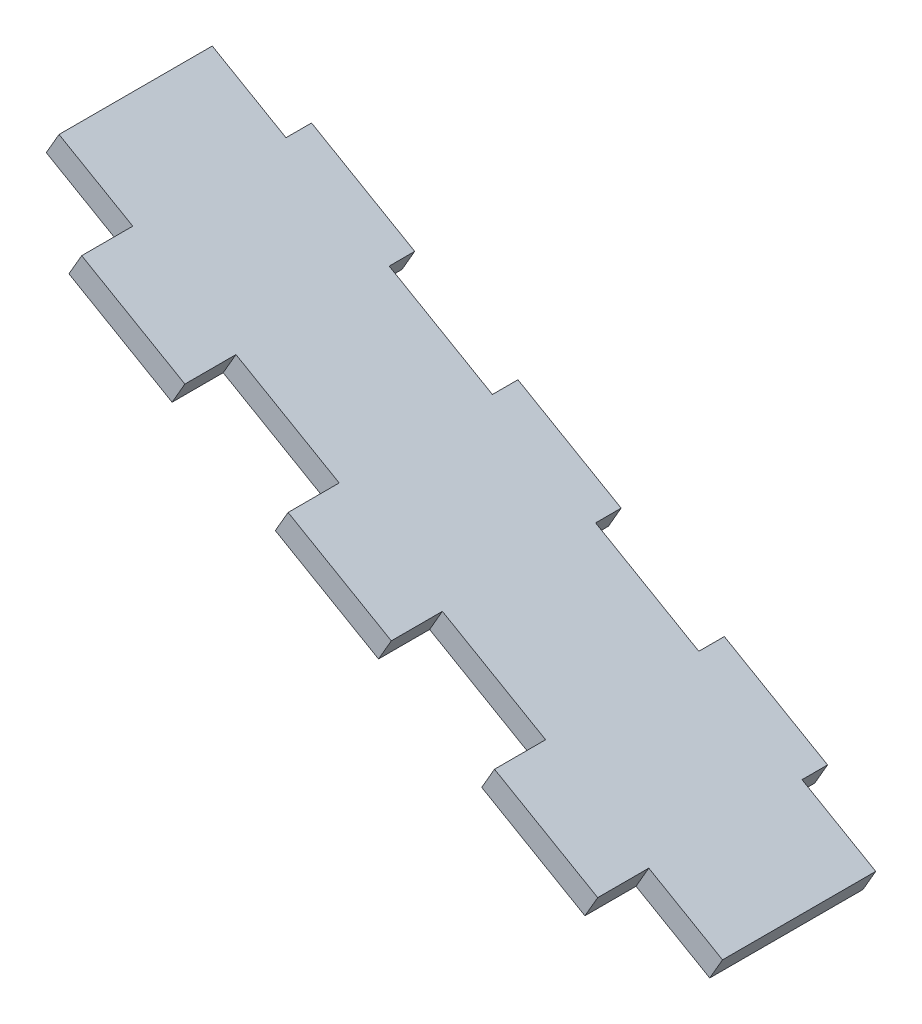
ISO-10303-21;
HEADER;
FILE_DESCRIPTION(('STEP AP214'),'2;1');
FILE_NAME('part.step','',(''),(''),'','','');
FILE_SCHEMA(('AUTOMOTIVE_DESIGN { 1 0 10303 214 1 1 1 1 }'));
ENDSEC;
DATA;
#1=APPLICATION_CONTEXT('core data for automotive mechanical design processes');
#2=APPLICATION_PROTOCOL_DEFINITION('international standard','automotive_design',2000,#1);
#3=PRODUCT_CONTEXT('',#1,'mechanical');
#4=PRODUCT('Part','Part','',(#3));
#5=PRODUCT_RELATED_PRODUCT_CATEGORY('part','',(#4));
#6=PRODUCT_DEFINITION_FORMATION('','',#4);
#7=PRODUCT_DEFINITION_CONTEXT('part definition',#1,'design');
#8=PRODUCT_DEFINITION('design','',#6,#7);
#9=PRODUCT_DEFINITION_SHAPE('','',#8);
#10=(LENGTH_UNIT() NAMED_UNIT(*) SI_UNIT(.MILLI.,.METRE.));
#11=(NAMED_UNIT(*) PLANE_ANGLE_UNIT() SI_UNIT($,.RADIAN.));
#12=(NAMED_UNIT(*) SI_UNIT($,.STERADIAN.) SOLID_ANGLE_UNIT());
#13=UNCERTAINTY_MEASURE_WITH_UNIT(LENGTH_MEASURE(1.E-05),#10,'distance_accuracy_value','');
#14=(GEOMETRIC_REPRESENTATION_CONTEXT(3) GLOBAL_UNCERTAINTY_ASSIGNED_CONTEXT((#13)) GLOBAL_UNIT_ASSIGNED_CONTEXT((#10,
#11,#12)) REPRESENTATION_CONTEXT('',''));
#15=CARTESIAN_POINT('',(0.,0.,0.));
#16=DIRECTION('',(0.,0.,1.));
#17=DIRECTION('',(1.,0.,0.));
#18=AXIS2_PLACEMENT_3D('',#15,#16,#17);
#19=CARTESIAN_POINT('',(0.,0.,0.));
#20=DIRECTION('',(0.,0.,1.));
#21=DIRECTION('',(1.,0.,0.));
#22=AXIS2_PLACEMENT_3D('',#19,#20,#21);
#23=PLANE('',#22);
#24=DIRECTION('',(-0.866025403784439,0.5,0.));
#25=VECTOR('',#24,1.);
#26=CARTESIAN_POINT('',(9.07059648121,-164.289266039593,0.));
#27=LINE('',#26,#25);
#28=CARTESIAN_POINT('',(-129.4934681243,-84.2892660395931,0.));
#29=VERTEX_POINT('',#28);
#30=CARTESIAN_POINT('',(-146.813976199989,-74.2892660395931,0.));
#31=VERTEX_POINT('',#30);
#32=EDGE_CURVE('E386',#29,#31,#27,.T.);
#33=ORIENTED_EDGE('',*,*,#32,.F.);
#34=DIRECTION('',(-0.499999999999996,-0.866025403784441,0.));
#35=VECTOR('',#34,1.);
#36=CARTESIAN_POINT('',(-60.6217782649096,34.999999999999,0.));
#37=LINE('',#36,#35);
#38=CARTESIAN_POINT('',(-132.4934681243,-89.4854184622997,0.));
#39=VERTEX_POINT('',#38);
#40=EDGE_CURVE('E280',#29,#39,#37,.T.);
#41=ORIENTED_EDGE('',*,*,#40,.T.);
#42=DIRECTION('',(0.866025403784439,-0.5,0.));
#43=VECTOR('',#42,1.);
#44=CARTESIAN_POINT('',(6.07059648121,-169.4854184623,0.));
#45=LINE('',#44,#43);
#46=CARTESIAN_POINT('',(-149.813976199989,-79.4854184622997,0.));
#47=VERTEX_POINT('',#46);
#48=EDGE_CURVE('E371',#47,#39,#45,.T.);
#49=ORIENTED_EDGE('',*,*,#48,.F.);
#50=DIRECTION('',(-0.5,-0.866025403784439,0.));
#51=VECTOR('',#50,1.);
#52=CARTESIAN_POINT('',(-149.813976199989,-79.4854184622997,0.));
#53=LINE('',#52,#51);
#54=EDGE_CURVE('E377',#31,#47,#53,.T.);
#55=ORIENTED_EDGE('',*,*,#54,.F.);
#56=EDGE_LOOP('',(#33,#41,#49,#55));
#57=FACE_BOUND('',#56,.T.);
#58=ADVANCED_FACE('F39',(#57),#23,.F.);
#59=CARTESIAN_POINT('',(-124.147184792664,-54.4669788164673,35.9999999999968));
#60=DIRECTION('',(0.,0.,1.));
#61=DIRECTION('',(0.499999999999992,0.866025403784443,0.));
#62=AXIS2_PLACEMENT_3D('',#59,#60,#61);
#63=PLANE('',#62);
#64=DIRECTION('',(-0.499999999999996,-0.866025403784441,0.));
#65=VECTOR('',#64,1.);
#66=CARTESIAN_POINT('',(-115.2434681243,-59.6075420317353,35.9999999999968));
#67=LINE('',#66,#65);
#68=CARTESIAN_POINT('',(-129.4934681243,-84.289266039593,35.9999999999968));
#69=VERTEX_POINT('',#68);
#70=CARTESIAN_POINT('',(-132.4934681243,-89.4854184622997,35.9999999999968));
#71=VERTEX_POINT('',#70);
#72=EDGE_CURVE('E54',#69,#71,#67,.T.);
#73=ORIENTED_EDGE('',*,*,#72,.F.);
#74=DIRECTION('',(-0.866025403784439,0.5,0.));
#75=VECTOR('',#74,1.);
#76=CARTESIAN_POINT('',(9.07059648120997,-164.289266039593,35.9999999999968));
#77=LINE('',#76,#75);
#78=CARTESIAN_POINT('',(-146.813976199989,-74.2892660395931,35.9999999999968));
#79=VERTEX_POINT('',#78);
#80=EDGE_CURVE('E233',#69,#79,#77,.T.);
#81=ORIENTED_EDGE('',*,*,#80,.T.);
#82=DIRECTION('',(-0.5,-0.866025403784439,0.));
#83=VECTOR('',#82,1.);
#84=CARTESIAN_POINT('',(-149.813976199989,-79.4854184622997,35.9999999999968));
#85=LINE('',#84,#83);
#86=CARTESIAN_POINT('',(-149.813976199989,-79.4854184622997,35.9999999999968));
#87=VERTEX_POINT('',#86);
#88=EDGE_CURVE('E391',#79,#87,#85,.T.);
#89=ORIENTED_EDGE('',*,*,#88,.T.);
#90=DIRECTION('',(0.866025403784439,-0.5,0.));
#91=VECTOR('',#90,1.);
#92=CARTESIAN_POINT('',(6.07059648120998,-169.4854184623,35.9999999999968));
#93=LINE('',#92,#91);
#94=EDGE_CURVE('E401',#87,#71,#93,.T.);
#95=ORIENTED_EDGE('',*,*,#94,.T.);
#96=EDGE_LOOP('',(#73,#81,#89,#95));
#97=FACE_BOUND('',#96,.T.);
#98=ADVANCED_FACE('F424',(#97),#63,.T.);
#99=CARTESIAN_POINT('',(-108.244756818336,-103.4854184623,0.));
#100=VERTEX_POINT('',#99);
#101=CARTESIAN_POINT('',(-83.9960455123716,-117.4854184623,0.));
#102=VERTEX_POINT('',#101);
#103=EDGE_CURVE('E375',#100,#102,#45,.T.);
#104=ORIENTED_EDGE('',*,*,#103,.F.);
#105=DIRECTION('',(0.5,0.866025403784439,0.));
#106=VECTOR('',#105,1.);
#107=CARTESIAN_POINT('',(-36.3730669589446,20.9999999999989,0.));
#108=LINE('',#107,#106);
#109=CARTESIAN_POINT('',(-105.244756818336,-98.2892660395931,0.));
#110=VERTEX_POINT('',#109);
#111=EDGE_CURVE('E276',#100,#110,#108,.T.);
#112=ORIENTED_EDGE('',*,*,#111,.T.);
#113=CARTESIAN_POINT('',(-80.9960455123716,-112.289266039593,0.));
#114=VERTEX_POINT('',#113);
#115=EDGE_CURVE('E432',#114,#110,#27,.T.);
#116=ORIENTED_EDGE('',*,*,#115,.F.);
#117=DIRECTION('',(0.500000000000001,0.866025403784438,0.));
#118=VECTOR('',#117,1.);
#119=CARTESIAN_POINT('',(-12.1243556529801,6.99999999999882,0.));
#120=LINE('',#119,#118);
#121=EDGE_CURVE('E318',#102,#114,#120,.T.);
#122=ORIENTED_EDGE('',*,*,#121,.F.);
#123=EDGE_LOOP('',(#104,#112,#116,#122));
#124=FACE_BOUND('',#123,.T.);
#125=ADVANCED_FACE('F462',(#124),#23,.F.);
#126=DIRECTION('',(0.5,0.866025403784439,0.));
#127=VECTOR('',#126,1.);
#128=CARTESIAN_POINT('',(-90.9947568183352,-73.6075420317354,35.9999999999968));
#129=LINE('',#128,#127);
#130=CARTESIAN_POINT('',(-108.244756818336,-103.4854184623,35.9999999999968));
#131=VERTEX_POINT('',#130);
#132=CARTESIAN_POINT('',(-105.244756818336,-98.289266039593,35.9999999999968));
#133=VERTEX_POINT('',#132);
#134=EDGE_CURVE('E274',#131,#133,#129,.T.);
#135=ORIENTED_EDGE('',*,*,#134,.F.);
#136=CARTESIAN_POINT('',(-83.9960455123716,-117.4854184623,35.9999999999968));
#137=VERTEX_POINT('',#136);
#138=EDGE_CURVE('E403',#131,#137,#93,.T.);
#139=ORIENTED_EDGE('',*,*,#138,.T.);
#140=DIRECTION('',(0.500000000000001,0.866025403784438,0.));
#141=VECTOR('',#140,1.);
#142=CARTESIAN_POINT('',(-66.746045512371,-87.6075420317356,35.9999999999968));
#143=LINE('',#142,#141);
#144=CARTESIAN_POINT('',(-80.9960455123716,-112.289266039593,35.9999999999968));
#145=VERTEX_POINT('',#144);
#146=EDGE_CURVE('E47',#137,#145,#143,.T.);
#147=ORIENTED_EDGE('',*,*,#146,.T.);
#148=EDGE_CURVE('E62',#145,#133,#77,.T.);
#149=ORIENTED_EDGE('',*,*,#148,.T.);
#150=EDGE_LOOP('',(#135,#139,#147,#149));
#151=FACE_BOUND('',#150,.T.);
#152=ADVANCED_FACE('F416',(#151),#63,.T.);
#153=CARTESIAN_POINT('',(-11.2499115944788,-159.4854184623,0.));
#154=VERTEX_POINT('',#153);
#155=CARTESIAN_POINT('',(6.07059648121,-169.4854184623,0.));
#156=VERTEX_POINT('',#155);
#157=EDGE_CURVE('E376',#154,#156,#45,.T.);
#158=ORIENTED_EDGE('',*,*,#157,.F.);
#159=DIRECTION('',(0.500000000000001,0.866025403784438,0.));
#160=VECTOR('',#159,1.);
#161=CARTESIAN_POINT('',(60.6217782649127,-35.0000000000012,0.));
#162=LINE('',#161,#160);
#163=CARTESIAN_POINT('',(-8.24991159447876,-154.289266039593,0.));
#164=VERTEX_POINT('',#163);
#165=EDGE_CURVE('E367',#154,#164,#162,.T.);
#166=ORIENTED_EDGE('',*,*,#165,.T.);
#167=CARTESIAN_POINT('',(9.07059648121,-164.289266039593,0.));
#168=VERTEX_POINT('',#167);
#169=EDGE_CURVE('E382',#168,#164,#27,.T.);
#170=ORIENTED_EDGE('',*,*,#169,.F.);
#171=DIRECTION('',(0.5,0.866025403784439,0.));
#172=VECTOR('',#171,1.);
#173=CARTESIAN_POINT('',(6.07059648121,-169.4854184623,0.));
#174=LINE('',#173,#172);
#175=EDGE_CURVE('E387',#156,#168,#174,.T.);
#176=ORIENTED_EDGE('',*,*,#175,.F.);
#177=EDGE_LOOP('',(#158,#166,#170,#176));
#178=FACE_BOUND('',#177,.T.);
#179=ADVANCED_FACE('F496',(#178),#23,.F.);
#180=DIRECTION('',(0.500000000000001,0.866025403784438,0.));
#181=VECTOR('',#180,1.);
#182=CARTESIAN_POINT('',(6.00008840552182,-129.607542031736,35.9999999999968));
#183=LINE('',#182,#181);
#184=CARTESIAN_POINT('',(-11.2499115944788,-159.4854184623,35.9999999999968));
#185=VERTEX_POINT('',#184);
#186=CARTESIAN_POINT('',(-8.24991159447876,-154.289266039593,35.9999999999968));
#187=VERTEX_POINT('',#186);
#188=EDGE_CURVE('E412',#185,#187,#183,.T.);
#189=ORIENTED_EDGE('',*,*,#188,.F.);
#190=CARTESIAN_POINT('',(6.07059648121,-169.4854184623,35.9999999999968));
#191=VERTEX_POINT('',#190);
#192=EDGE_CURVE('E374',#185,#191,#93,.T.);
#193=ORIENTED_EDGE('',*,*,#192,.T.);
#194=DIRECTION('',(0.5,0.866025403784439,0.));
#195=VECTOR('',#194,1.);
#196=CARTESIAN_POINT('',(6.07059648121002,-169.4854184623,35.9999999999968));
#197=LINE('',#196,#195);
#198=CARTESIAN_POINT('',(9.07059648121,-164.289266039593,35.9999999999968));
#199=VERTEX_POINT('',#198);
#200=EDGE_CURVE('E398',#191,#199,#197,.T.);
#201=ORIENTED_EDGE('',*,*,#200,.T.);
#202=EDGE_CURVE('E395',#199,#187,#77,.T.);
#203=ORIENTED_EDGE('',*,*,#202,.T.);
#204=EDGE_LOOP('',(#189,#193,#201,#203));
#205=FACE_BOUND('',#204,.T.);
#206=ADVANCED_FACE('F504',(#205),#63,.T.);
#207=CARTESIAN_POINT('',(6.07059648121,-169.4854184623,221.220449389837));
#208=DIRECTION('',(-0.866025403784438,0.5,0.));
#209=DIRECTION('',(-0.5,-0.866025403784439,0.));
#210=AXIS2_PLACEMENT_3D('',#207,#208,#209);
#211=PLANE('',#210);
#212=ORIENTED_EDGE('',*,*,#200,.F.);
#213=DIRECTION('',(0.,0.,-1.));
#214=VECTOR('',#213,1.);
#215=CARTESIAN_POINT('',(6.07059648121,-169.4854184623,221.220449389837));
#216=LINE('',#215,#214);
#217=EDGE_CURVE('E370',#191,#156,#216,.T.);
#218=ORIENTED_EDGE('',*,*,#217,.T.);
#219=ORIENTED_EDGE('',*,*,#175,.T.);
#220=DIRECTION('',(0.,0.,-1.));
#221=VECTOR('',#220,1.);
#222=CARTESIAN_POINT('',(9.07059648121,-164.289266039593,221.220449389837));
#223=LINE('',#222,#221);
#224=EDGE_CURVE('E390',#199,#168,#223,.T.);
#225=ORIENTED_EDGE('',*,*,#224,.F.);
#226=EDGE_LOOP('',(#212,#218,#219,#225));
#227=FACE_BOUND('',#226,.T.);
#228=ADVANCED_FACE('F511',(#227),#211,.F.);
#229=CARTESIAN_POINT('',(9.07059648121,-164.289266039593,221.220449389837));
#230=DIRECTION('',(-0.5,-0.866025403784439,0.));
#231=DIRECTION('',(0.866025403784439,-0.5,0.));
#232=AXIS2_PLACEMENT_3D('',#229,#230,#231);
#233=PLANE('',#232);
#234=ORIENTED_EDGE('',*,*,#115,.T.);
#235=DIRECTION('',(0.,0.,1.));
#236=VECTOR('',#235,1.);
#237=CARTESIAN_POINT('',(-105.244756818336,-98.2892660395931,-6.));
#238=LINE('',#237,#236);
#239=CARTESIAN_POINT('',(-105.244756818336,-98.2892660395931,-6.));
#240=VERTEX_POINT('',#239);
#241=EDGE_CURVE('E236',#240,#110,#238,.T.);
#242=ORIENTED_EDGE('',*,*,#241,.F.);
#243=DIRECTION('',(0.866025403784439,-0.5,0.));
#244=VECTOR('',#243,1.);
#245=CARTESIAN_POINT('',(-68.8716898593913,-119.289266039592,-6.));
#246=LINE('',#245,#244);
#247=CARTESIAN_POINT('',(-129.4934681243,-84.2892660395931,-6.));
#248=VERTEX_POINT('',#247);
#249=EDGE_CURVE('E259',#248,#240,#246,.T.);
#250=ORIENTED_EDGE('',*,*,#249,.F.);
#251=DIRECTION('',(0.,0.,1.));
#252=VECTOR('',#251,1.);
#253=CARTESIAN_POINT('',(-129.4934681243,-84.2892660395931,-6.));
#254=LINE('',#253,#252);
#255=EDGE_CURVE('E235',#248,#29,#254,.T.);
#256=ORIENTED_EDGE('',*,*,#255,.T.);
#257=ORIENTED_EDGE('',*,*,#32,.T.);
#258=DIRECTION('',(0.,0.,-1.));
#259=VECTOR('',#258,1.);
#260=CARTESIAN_POINT('',(-146.813976199989,-74.2892660395931,221.220449389837));
#261=LINE('',#260,#259);
#262=EDGE_CURVE('E381',#79,#31,#261,.T.);
#263=ORIENTED_EDGE('',*,*,#262,.F.);
#264=ORIENTED_EDGE('',*,*,#80,.F.);
#265=CARTESIAN_POINT('',(-129.4934681243,-84.2892660395931,48.));
#266=VERTEX_POINT('',#265);
#267=EDGE_CURVE('E225',#69,#266,#254,.T.);
#268=ORIENTED_EDGE('',*,*,#267,.T.);
#269=DIRECTION('',(0.866025403784439,-0.5,0.));
#270=VECTOR('',#269,1.);
#271=CARTESIAN_POINT('',(-68.8716898593913,-119.289266039592,48.));
#272=LINE('',#271,#270);
#273=CARTESIAN_POINT('',(-105.244756818336,-98.2892660395931,48.));
#274=VERTEX_POINT('',#273);
#275=EDGE_CURVE('E231',#266,#274,#272,.T.);
#276=ORIENTED_EDGE('',*,*,#275,.T.);
#277=EDGE_CURVE('E271',#133,#274,#238,.T.);
#278=ORIENTED_EDGE('',*,*,#277,.F.);
#279=ORIENTED_EDGE('',*,*,#148,.F.);
#280=DIRECTION('',(0.,0.,1.));
#281=VECTOR('',#280,1.);
#282=CARTESIAN_POINT('',(-80.9960455123716,-112.289266039593,-6.));
#283=LINE('',#282,#281);
#284=CARTESIAN_POINT('',(-80.9960455123716,-112.289266039593,48.));
#285=VERTEX_POINT('',#284);
#286=EDGE_CURVE('E307',#145,#285,#283,.T.);
#287=ORIENTED_EDGE('',*,*,#286,.T.);
#288=DIRECTION('',(0.866025403784439,-0.5,0.));
#289=VECTOR('',#288,1.);
#290=CARTESIAN_POINT('',(-68.8716898593913,-119.289266039592,48.));
#291=LINE('',#290,#289);
#292=CARTESIAN_POINT('',(-56.7473342064073,-126.289266039593,48.));
#293=VERTEX_POINT('',#292);
#294=EDGE_CURVE('E292',#285,#293,#291,.T.);
#295=ORIENTED_EDGE('',*,*,#294,.T.);
#296=DIRECTION('',(0.,0.,1.));
#297=VECTOR('',#296,1.);
#298=CARTESIAN_POINT('',(-56.7473342064073,-126.289266039593,-6.));
#299=LINE('',#298,#297);
#300=CARTESIAN_POINT('',(-56.7473342064073,-126.289266039593,35.9999999999968));
#301=VERTEX_POINT('',#300);
#302=EDGE_CURVE('E304',#301,#293,#299,.T.);
#303=ORIENTED_EDGE('',*,*,#302,.F.);
#304=CARTESIAN_POINT('',(-32.498622900443,-140.289266039593,35.9999999999968));
#305=VERTEX_POINT('',#304);
#306=EDGE_CURVE('E397',#305,#301,#77,.T.);
#307=ORIENTED_EDGE('',*,*,#306,.F.);
#308=DIRECTION('',(0.,0.,-1.));
#309=VECTOR('',#308,1.);
#310=CARTESIAN_POINT('',(-32.4986229004431,-140.289266039593,48.));
#311=LINE('',#310,#309);
#312=CARTESIAN_POINT('',(-32.4986229004431,-140.289266039593,48.));
#313=VERTEX_POINT('',#312);
#314=EDGE_CURVE('E358',#313,#305,#311,.T.);
#315=ORIENTED_EDGE('',*,*,#314,.F.);
#316=DIRECTION('',(0.866025403784439,-0.5,0.));
#317=VECTOR('',#316,1.);
#318=CARTESIAN_POINT('',(-68.8716898593913,-119.289266039592,48.));
#319=LINE('',#318,#317);
#320=CARTESIAN_POINT('',(-8.24991159447876,-154.289266039593,48.));
#321=VERTEX_POINT('',#320);
#322=EDGE_CURVE('E342',#313,#321,#319,.T.);
#323=ORIENTED_EDGE('',*,*,#322,.T.);
#324=DIRECTION('',(0.,0.,-1.));
#325=VECTOR('',#324,1.);
#326=CARTESIAN_POINT('',(-8.24991159447876,-154.289266039593,48.));
#327=LINE('',#326,#325);
#328=EDGE_CURVE('E354',#321,#187,#327,.T.);
#329=ORIENTED_EDGE('',*,*,#328,.T.);
#330=ORIENTED_EDGE('',*,*,#202,.F.);
#331=ORIENTED_EDGE('',*,*,#224,.T.);
#332=ORIENTED_EDGE('',*,*,#169,.T.);
#333=CARTESIAN_POINT('',(-8.24991159447876,-154.289266039593,-6.));
#334=VERTEX_POINT('',#333);
#335=EDGE_CURVE('E357',#164,#334,#327,.T.);
#336=ORIENTED_EDGE('',*,*,#335,.T.);
#337=DIRECTION('',(0.866025403784439,-0.5,0.));
#338=VECTOR('',#337,1.);
#339=CARTESIAN_POINT('',(-68.8716898593913,-119.289266039592,-6.));
#340=LINE('',#339,#338);
#341=CARTESIAN_POINT('',(-32.4986229004431,-140.289266039593,-6.));
#342=VERTEX_POINT('',#341);
#343=EDGE_CURVE('E330',#342,#334,#340,.T.);
#344=ORIENTED_EDGE('',*,*,#343,.F.);
#345=CARTESIAN_POINT('',(-32.4986229004431,-140.289266039593,0.));
#346=VERTEX_POINT('',#345);
#347=EDGE_CURVE('E361',#346,#342,#311,.T.);
#348=ORIENTED_EDGE('',*,*,#347,.F.);
#349=CARTESIAN_POINT('',(-56.7473342064073,-126.289266039593,0.));
#350=VERTEX_POINT('',#349);
#351=EDGE_CURVE('E385',#346,#350,#27,.T.);
#352=ORIENTED_EDGE('',*,*,#351,.T.);
#353=CARTESIAN_POINT('',(-56.7473342064073,-126.289266039593,-6.));
#354=VERTEX_POINT('',#353);
#355=EDGE_CURVE('E305',#354,#350,#299,.T.);
#356=ORIENTED_EDGE('',*,*,#355,.F.);
#357=DIRECTION('',(0.866025403784439,-0.5,0.));
#358=VECTOR('',#357,1.);
#359=CARTESIAN_POINT('',(-68.8716898593913,-119.289266039592,-6.));
#360=LINE('',#359,#358);
#361=CARTESIAN_POINT('',(-80.9960455123716,-112.289266039593,-6.));
#362=VERTEX_POINT('',#361);
#363=EDGE_CURVE('E302',#362,#354,#360,.T.);
#364=ORIENTED_EDGE('',*,*,#363,.F.);
#365=EDGE_CURVE('E308',#362,#114,#283,.T.);
#366=ORIENTED_EDGE('',*,*,#365,.T.);
#367=EDGE_LOOP('',(#234,#242,#250,#256,#257,#263,#264,#268,#276,#278,#279,#287,#295,#303,#307,
#315,#323,#329,#330,#331,#332,#336,#344,#348,#352,#356,#364,#366));
#368=FACE_BOUND('',#367,.T.);
#369=ADVANCED_FACE('F228',(#368),#233,.F.);
#370=CARTESIAN_POINT('',(-149.813976199989,-79.4854184622997,221.220449389837));
#371=DIRECTION('',(0.866025403784439,-0.5,0.));
#372=DIRECTION('',(0.5,0.866025403784439,0.));
#373=AXIS2_PLACEMENT_3D('',#370,#371,#372);
#374=PLANE('',#373);
#375=ORIENTED_EDGE('',*,*,#88,.F.);
#376=ORIENTED_EDGE('',*,*,#262,.T.);
#377=ORIENTED_EDGE('',*,*,#54,.T.);
#378=DIRECTION('',(0.,0.,-1.));
#379=VECTOR('',#378,1.);
#380=CARTESIAN_POINT('',(-149.813976199989,-79.4854184622997,221.220449389837));
#381=LINE('',#380,#379);
#382=EDGE_CURVE('E380',#87,#47,#381,.T.);
#383=ORIENTED_EDGE('',*,*,#382,.F.);
#384=EDGE_LOOP('',(#375,#376,#377,#383));
#385=FACE_BOUND('',#384,.T.);
#386=ADVANCED_FACE('F426',(#385),#374,.F.);
#387=CARTESIAN_POINT('',(6.07059648121,-169.4854184623,221.220449389837));
#388=DIRECTION('',(0.5,0.866025403784439,0.));
#389=DIRECTION('',(-0.866025403784439,0.5,0.));
#390=AXIS2_PLACEMENT_3D('',#387,#388,#389);
#391=PLANE('',#390);
#392=ORIENTED_EDGE('',*,*,#138,.F.);
#393=DIRECTION('',(0.,0.,1.));
#394=VECTOR('',#393,1.);
#395=CARTESIAN_POINT('',(-108.244756818336,-103.4854184623,-6.));
#396=LINE('',#395,#394);
#397=CARTESIAN_POINT('',(-108.244756818336,-103.4854184623,48.));
#398=VERTEX_POINT('',#397);
#399=EDGE_CURVE('E268',#131,#398,#396,.T.);
#400=ORIENTED_EDGE('',*,*,#399,.T.);
#401=DIRECTION('',(-0.866025403784439,0.5,0.));
#402=VECTOR('',#401,1.);
#403=CARTESIAN_POINT('',(-71.8716898593913,-124.485418462299,48.));
#404=LINE('',#403,#402);
#405=CARTESIAN_POINT('',(-132.4934681243,-89.4854184622997,48.));
#406=VERTEX_POINT('',#405);
#407=EDGE_CURVE('E252',#398,#406,#404,.T.);
#408=ORIENTED_EDGE('',*,*,#407,.T.);
#409=DIRECTION('',(0.,0.,1.));
#410=VECTOR('',#409,1.);
#411=CARTESIAN_POINT('',(-132.4934681243,-89.4854184622997,-6.));
#412=LINE('',#411,#410);
#413=EDGE_CURVE('E242',#71,#406,#412,.T.);
#414=ORIENTED_EDGE('',*,*,#413,.F.);
#415=ORIENTED_EDGE('',*,*,#94,.F.);
#416=ORIENTED_EDGE('',*,*,#382,.T.);
#417=ORIENTED_EDGE('',*,*,#48,.T.);
#418=CARTESIAN_POINT('',(-132.4934681243,-89.4854184622997,-6.));
#419=VERTEX_POINT('',#418);
#420=EDGE_CURVE('E266',#419,#39,#412,.T.);
#421=ORIENTED_EDGE('',*,*,#420,.F.);
#422=DIRECTION('',(-0.866025403784439,0.5,0.));
#423=VECTOR('',#422,1.);
#424=CARTESIAN_POINT('',(-71.8716898593913,-124.485418462299,-6.));
#425=LINE('',#424,#423);
#426=CARTESIAN_POINT('',(-108.244756818336,-103.4854184623,-6.));
#427=VERTEX_POINT('',#426);
#428=EDGE_CURVE('E264',#427,#419,#425,.T.);
#429=ORIENTED_EDGE('',*,*,#428,.F.);
#430=EDGE_CURVE('E269',#427,#100,#396,.T.);
#431=ORIENTED_EDGE('',*,*,#430,.T.);
#432=ORIENTED_EDGE('',*,*,#103,.T.);
#433=DIRECTION('',(0.,0.,1.));
#434=VECTOR('',#433,1.);
#435=CARTESIAN_POINT('',(-83.9960455123716,-117.4854184623,-6.));
#436=LINE('',#435,#434);
#437=CARTESIAN_POINT('',(-83.9960455123716,-117.4854184623,-6.));
#438=VERTEX_POINT('',#437);
#439=EDGE_CURVE('E311',#438,#102,#436,.T.);
#440=ORIENTED_EDGE('',*,*,#439,.F.);
#441=DIRECTION('',(-0.866025403784439,0.5,0.));
#442=VECTOR('',#441,1.);
#443=CARTESIAN_POINT('',(-71.8716898593913,-124.485418462299,-6.));
#444=LINE('',#443,#442);
#445=CARTESIAN_POINT('',(-59.7473342064073,-131.4854184623,-6.));
#446=VERTEX_POINT('',#445);
#447=EDGE_CURVE('E298',#446,#438,#444,.T.);
#448=ORIENTED_EDGE('',*,*,#447,.F.);
#449=DIRECTION('',(0.,0.,1.));
#450=VECTOR('',#449,1.);
#451=CARTESIAN_POINT('',(-59.7473342064073,-131.4854184623,-6.));
#452=LINE('',#451,#450);
#453=CARTESIAN_POINT('',(-59.7473342064073,-131.4854184623,0.));
#454=VERTEX_POINT('',#453);
#455=EDGE_CURVE('E315',#446,#454,#452,.T.);
#456=ORIENTED_EDGE('',*,*,#455,.T.);
#457=CARTESIAN_POINT('',(-35.4986229004431,-145.4854184623,0.));
#458=VERTEX_POINT('',#457);
#459=EDGE_CURVE('E444',#454,#458,#45,.T.);
#460=ORIENTED_EDGE('',*,*,#459,.T.);
#461=DIRECTION('',(0.,0.,-1.));
#462=VECTOR('',#461,1.);
#463=CARTESIAN_POINT('',(-35.4986229004431,-145.4854184623,48.));
#464=LINE('',#463,#462);
#465=CARTESIAN_POINT('',(-35.4986229004431,-145.4854184623,-6.));
#466=VERTEX_POINT('',#465);
#467=EDGE_CURVE('E348',#458,#466,#464,.T.);
#468=ORIENTED_EDGE('',*,*,#467,.T.);
#469=DIRECTION('',(-0.866025403784439,0.5,0.));
#470=VECTOR('',#469,1.);
#471=CARTESIAN_POINT('',(-71.8716898593913,-124.485418462299,-6.));
#472=LINE('',#471,#470);
#473=CARTESIAN_POINT('',(-11.2499115944788,-159.4854184623,-6.));
#474=VERTEX_POINT('',#473);
#475=EDGE_CURVE('E324',#474,#466,#472,.T.);
#476=ORIENTED_EDGE('',*,*,#475,.F.);
#477=DIRECTION('',(0.,0.,-1.));
#478=VECTOR('',#477,1.);
#479=CARTESIAN_POINT('',(-11.2499115944788,-159.4854184623,48.));
#480=LINE('',#479,#478);
#481=EDGE_CURVE('E353',#154,#474,#480,.T.);
#482=ORIENTED_EDGE('',*,*,#481,.F.);
#483=ORIENTED_EDGE('',*,*,#157,.T.);
#484=ORIENTED_EDGE('',*,*,#217,.F.);
#485=ORIENTED_EDGE('',*,*,#192,.F.);
#486=CARTESIAN_POINT('',(-11.2499115944788,-159.4854184623,48.));
#487=VERTEX_POINT('',#486);
#488=EDGE_CURVE('E349',#487,#185,#480,.T.);
#489=ORIENTED_EDGE('',*,*,#488,.F.);
#490=DIRECTION('',(-0.866025403784439,0.5,0.));
#491=VECTOR('',#490,1.);
#492=CARTESIAN_POINT('',(-71.8716898593913,-124.485418462299,48.));
#493=LINE('',#492,#491);
#494=CARTESIAN_POINT('',(-35.4986229004431,-145.4854184623,48.));
#495=VERTEX_POINT('',#494);
#496=EDGE_CURVE('E336',#487,#495,#493,.T.);
#497=ORIENTED_EDGE('',*,*,#496,.T.);
#498=CARTESIAN_POINT('',(-35.4986229004431,-145.4854184623,35.9999999999968));
#499=VERTEX_POINT('',#498);
#500=EDGE_CURVE('E362',#495,#499,#464,.T.);
#501=ORIENTED_EDGE('',*,*,#500,.T.);
#502=CARTESIAN_POINT('',(-59.7473342064073,-131.4854184623,35.9999999999968));
#503=VERTEX_POINT('',#502);
#504=EDGE_CURVE('E523',#503,#499,#93,.T.);
#505=ORIENTED_EDGE('',*,*,#504,.F.);
#506=CARTESIAN_POINT('',(-59.7473342064073,-131.4854184623,48.));
#507=VERTEX_POINT('',#506);
#508=EDGE_CURVE('E314',#503,#507,#452,.T.);
#509=ORIENTED_EDGE('',*,*,#508,.T.);
#510=DIRECTION('',(-0.866025403784439,0.5,0.));
#511=VECTOR('',#510,1.);
#512=CARTESIAN_POINT('',(-71.8716898593913,-124.485418462299,48.));
#513=LINE('',#512,#511);
#514=CARTESIAN_POINT('',(-83.9960455123716,-117.4854184623,48.));
#515=VERTEX_POINT('',#514);
#516=EDGE_CURVE('E286',#507,#515,#513,.T.);
#517=ORIENTED_EDGE('',*,*,#516,.T.);
#518=EDGE_CURVE('E310',#137,#515,#436,.T.);
#519=ORIENTED_EDGE('',*,*,#518,.F.);
#520=EDGE_LOOP('',(#392,#400,#408,#414,#415,#416,#417,#421,#429,#431,#432,#440,#448,#456,#460,
#468,#476,#482,#483,#484,#485,#489,#497,#501,#505,#509,#517,#519));
#521=FACE_BOUND('',#520,.T.);
#522=ADVANCED_FACE('F449',(#521),#391,.F.);
#523=ORIENTED_EDGE('',*,*,#459,.F.);
#524=DIRECTION('',(0.500000000000001,0.866025403784438,0.));
#525=VECTOR('',#524,1.);
#526=CARTESIAN_POINT('',(12.1243556529841,-7.00000000000112,0.));
#527=LINE('',#526,#525);
#528=EDGE_CURVE('E321',#454,#350,#527,.T.);
#529=ORIENTED_EDGE('',*,*,#528,.T.);
#530=ORIENTED_EDGE('',*,*,#351,.F.);
#531=DIRECTION('',(-0.500000000000001,-0.866025403784438,0.));
#532=VECTOR('',#531,1.);
#533=CARTESIAN_POINT('',(36.3730669589483,-21.0000000000011,0.));
#534=LINE('',#533,#532);
#535=EDGE_CURVE('E352',#346,#458,#534,.T.);
#536=ORIENTED_EDGE('',*,*,#535,.T.);
#537=EDGE_LOOP('',(#523,#529,#530,#536));
#538=FACE_BOUND('',#537,.T.);
#539=ADVANCED_FACE('F443',(#538),#23,.F.);
#540=DIRECTION('',(0.500000000000001,0.866025403784438,0.));
#541=VECTOR('',#540,1.);
#542=CARTESIAN_POINT('',(-42.4973342064067,-101.607542031736,35.9999999999968));
#543=LINE('',#542,#541);
#544=EDGE_CURVE('E11',#503,#301,#543,.T.);
#545=ORIENTED_EDGE('',*,*,#544,.F.);
#546=ORIENTED_EDGE('',*,*,#504,.T.);
#547=DIRECTION('',(-0.500000000000001,-0.866025403784438,0.));
#548=VECTOR('',#547,1.);
#549=CARTESIAN_POINT('',(-18.2486229004424,-115.607542031736,35.9999999999968));
#550=LINE('',#549,#548);
#551=EDGE_CURVE('E394',#305,#499,#550,.T.);
#552=ORIENTED_EDGE('',*,*,#551,.F.);
#553=ORIENTED_EDGE('',*,*,#306,.T.);
#554=EDGE_LOOP('',(#545,#546,#552,#553));
#555=FACE_BOUND('',#554,.T.);
#556=ADVANCED_FACE('F41',(#555),#63,.T.);
#557=CARTESIAN_POINT('',(0.,0.,48.));
#558=DIRECTION('',(0.,0.,-1.));
#559=DIRECTION('',(-1.,0.,0.));
#560=AXIS2_PLACEMENT_3D('',#557,#558,#559);
#561=PLANE('',#560);
#562=ORIENTED_EDGE('',*,*,#496,.F.);
#563=DIRECTION('',(-0.500000000000001,-0.866025403784438,0.));
#564=VECTOR('',#563,1.);
#565=CARTESIAN_POINT('',(60.6217782649127,-35.0000000000012,48.));
#566=LINE('',#565,#564);
#567=EDGE_CURVE('E345',#321,#487,#566,.T.);
#568=ORIENTED_EDGE('',*,*,#567,.F.);
#569=ORIENTED_EDGE('',*,*,#322,.F.);
#570=DIRECTION('',(0.500000000000001,0.866025403784438,0.));
#571=VECTOR('',#570,1.);
#572=CARTESIAN_POINT('',(36.3730669589483,-21.0000000000011,48.));
#573=LINE('',#572,#571);
#574=EDGE_CURVE('E339',#495,#313,#573,.T.);
#575=ORIENTED_EDGE('',*,*,#574,.F.);
#576=EDGE_LOOP('',(#562,#568,#569,#575));
#577=FACE_BOUND('',#576,.T.);
#578=ADVANCED_FACE('F502',(#577),#561,.F.);
#579=CARTESIAN_POINT('',(36.3730669589483,-21.0000000000011,48.));
#580=DIRECTION('',(-0.866025403784438,0.500000000000001,0.));
#581=DIRECTION('',(-0.500000000000001,-0.866025403784438,0.));
#582=AXIS2_PLACEMENT_3D('',#579,#580,#581);
#583=PLANE('',#582);
#584=ORIENTED_EDGE('',*,*,#314,.T.);
#585=ORIENTED_EDGE('',*,*,#551,.T.);
#586=ORIENTED_EDGE('',*,*,#500,.F.);
#587=ORIENTED_EDGE('',*,*,#574,.T.);
#588=EDGE_LOOP('',(#584,#585,#586,#587));
#589=FACE_BOUND('',#588,.T.);
#590=ADVANCED_FACE('F528',(#589),#583,.T.);
#591=CARTESIAN_POINT('',(60.6217782649127,-35.0000000000012,48.));
#592=DIRECTION('',(0.866025403784438,-0.500000000000001,0.));
#593=DIRECTION('',(0.500000000000001,0.866025403784438,0.));
#594=AXIS2_PLACEMENT_3D('',#591,#592,#593);
#595=PLANE('',#594);
#596=ORIENTED_EDGE('',*,*,#488,.T.);
#597=ORIENTED_EDGE('',*,*,#188,.T.);
#598=ORIENTED_EDGE('',*,*,#328,.F.);
#599=ORIENTED_EDGE('',*,*,#567,.T.);
#600=EDGE_LOOP('',(#596,#597,#598,#599));
#601=FACE_BOUND('',#600,.T.);
#602=ADVANCED_FACE('F535',(#601),#595,.T.);
#603=ORIENTED_EDGE('',*,*,#165,.F.);
#604=ORIENTED_EDGE('',*,*,#481,.T.);
#605=DIRECTION('',(-0.500000000000001,-0.866025403784438,0.));
#606=VECTOR('',#605,1.);
#607=CARTESIAN_POINT('',(60.6217782649127,-35.0000000000012,-6.));
#608=LINE('',#607,#606);
#609=EDGE_CURVE('E333',#334,#474,#608,.T.);
#610=ORIENTED_EDGE('',*,*,#609,.F.);
#611=ORIENTED_EDGE('',*,*,#335,.F.);
#612=EDGE_LOOP('',(#603,#604,#610,#611));
#613=FACE_BOUND('',#612,.T.);
#614=ADVANCED_FACE('F561',(#613),#595,.T.);
#615=ORIENTED_EDGE('',*,*,#535,.F.);
#616=ORIENTED_EDGE('',*,*,#347,.T.);
#617=DIRECTION('',(0.500000000000001,0.866025403784438,0.));
#618=VECTOR('',#617,1.);
#619=CARTESIAN_POINT('',(36.3730669589483,-21.0000000000011,-6.));
#620=LINE('',#619,#618);
#621=EDGE_CURVE('E327',#466,#342,#620,.T.);
#622=ORIENTED_EDGE('',*,*,#621,.F.);
#623=ORIENTED_EDGE('',*,*,#467,.F.);
#624=EDGE_LOOP('',(#615,#616,#622,#623));
#625=FACE_BOUND('',#624,.T.);
#626=ADVANCED_FACE('F550',(#625),#583,.T.);
#627=CARTESIAN_POINT('',(0.,0.,-6.));
#628=DIRECTION('',(0.,0.,-1.));
#629=DIRECTION('',(-1.,0.,0.));
#630=AXIS2_PLACEMENT_3D('',#627,#628,#629);
#631=PLANE('',#630);
#632=ORIENTED_EDGE('',*,*,#475,.T.);
#633=ORIENTED_EDGE('',*,*,#621,.T.);
#634=ORIENTED_EDGE('',*,*,#343,.T.);
#635=ORIENTED_EDGE('',*,*,#609,.T.);
#636=EDGE_LOOP('',(#632,#633,#634,#635));
#637=FACE_BOUND('',#636,.T.);
#638=ADVANCED_FACE('F543',(#637),#631,.T.);
#639=CARTESIAN_POINT('',(0.,0.,48.));
#640=DIRECTION('',(0.,0.,-1.));
#641=DIRECTION('',(-1.,0.,0.));
#642=AXIS2_PLACEMENT_3D('',#639,#640,#641);
#643=PLANE('',#642);
#644=DIRECTION('',(0.500000000000001,0.866025403784438,0.));
#645=VECTOR('',#644,1.);
#646=CARTESIAN_POINT('',(12.1243556529841,-7.00000000000112,48.));
#647=LINE('',#646,#645);
#648=EDGE_CURVE('E283',#507,#293,#647,.T.);
#649=ORIENTED_EDGE('',*,*,#648,.T.);
#650=ORIENTED_EDGE('',*,*,#294,.F.);
#651=DIRECTION('',(0.500000000000001,0.866025403784438,0.));
#652=VECTOR('',#651,1.);
#653=CARTESIAN_POINT('',(-12.1243556529801,6.99999999999882,48.));
#654=LINE('',#653,#652);
#655=EDGE_CURVE('E289',#515,#285,#654,.T.);
#656=ORIENTED_EDGE('',*,*,#655,.F.);
#657=ORIENTED_EDGE('',*,*,#516,.F.);
#658=EDGE_LOOP('',(#649,#650,#656,#657));
#659=FACE_BOUND('',#658,.T.);
#660=ADVANCED_FACE('F541',(#659),#643,.F.);
#661=CARTESIAN_POINT('',(-12.1243556529801,6.99999999999882,-6.));
#662=DIRECTION('',(0.866025403784438,-0.500000000000001,0.));
#663=DIRECTION('',(0.500000000000001,0.866025403784438,0.));
#664=AXIS2_PLACEMENT_3D('',#661,#662,#663);
#665=PLANE('',#664);
#666=ORIENTED_EDGE('',*,*,#146,.F.);
#667=ORIENTED_EDGE('',*,*,#518,.T.);
#668=ORIENTED_EDGE('',*,*,#655,.T.);
#669=ORIENTED_EDGE('',*,*,#286,.F.);
#670=EDGE_LOOP('',(#666,#667,#668,#669));
#671=FACE_BOUND('',#670,.T.);
#672=ADVANCED_FACE('F419',(#671),#665,.F.);
#673=CARTESIAN_POINT('',(12.1243556529841,-7.00000000000112,-6.));
#674=DIRECTION('',(0.866025403784438,-0.500000000000001,0.));
#675=DIRECTION('',(0.500000000000001,0.866025403784438,0.));
#676=AXIS2_PLACEMENT_3D('',#673,#674,#675);
#677=PLANE('',#676);
#678=ORIENTED_EDGE('',*,*,#508,.F.);
#679=ORIENTED_EDGE('',*,*,#544,.T.);
#680=ORIENTED_EDGE('',*,*,#302,.T.);
#681=ORIENTED_EDGE('',*,*,#648,.F.);
#682=EDGE_LOOP('',(#678,#679,#680,#681));
#683=FACE_BOUND('',#682,.T.);
#684=ADVANCED_FACE('F537',(#683),#677,.T.);
#685=ORIENTED_EDGE('',*,*,#528,.F.);
#686=ORIENTED_EDGE('',*,*,#455,.F.);
#687=DIRECTION('',(0.500000000000001,0.866025403784438,0.));
#688=VECTOR('',#687,1.);
#689=CARTESIAN_POINT('',(12.1243556529841,-7.00000000000112,-6.));
#690=LINE('',#689,#688);
#691=EDGE_CURVE('E295',#446,#354,#690,.T.);
#692=ORIENTED_EDGE('',*,*,#691,.T.);
#693=ORIENTED_EDGE('',*,*,#355,.T.);
#694=EDGE_LOOP('',(#685,#686,#692,#693));
#695=FACE_BOUND('',#694,.T.);
#696=ADVANCED_FACE('F446',(#695),#677,.T.);
#697=ORIENTED_EDGE('',*,*,#439,.T.);
#698=ORIENTED_EDGE('',*,*,#121,.T.);
#699=ORIENTED_EDGE('',*,*,#365,.F.);
#700=DIRECTION('',(0.500000000000001,0.866025403784438,0.));
#701=VECTOR('',#700,1.);
#702=CARTESIAN_POINT('',(-12.1243556529801,6.99999999999882,-6.));
#703=LINE('',#702,#701);
#704=EDGE_CURVE('E300',#438,#362,#703,.T.);
#705=ORIENTED_EDGE('',*,*,#704,.F.);
#706=EDGE_LOOP('',(#697,#698,#699,#705));
#707=FACE_BOUND('',#706,.T.);
#708=ADVANCED_FACE('F459',(#707),#665,.F.);
#709=CARTESIAN_POINT('',(0.,0.,-6.));
#710=DIRECTION('',(0.,0.,-1.));
#711=DIRECTION('',(-1.,0.,0.));
#712=AXIS2_PLACEMENT_3D('',#709,#710,#711);
#713=PLANE('',#712);
#714=ORIENTED_EDGE('',*,*,#691,.F.);
#715=ORIENTED_EDGE('',*,*,#447,.T.);
#716=ORIENTED_EDGE('',*,*,#704,.T.);
#717=ORIENTED_EDGE('',*,*,#363,.T.);
#718=EDGE_LOOP('',(#714,#715,#716,#717));
#719=FACE_BOUND('',#718,.T.);
#720=ADVANCED_FACE('F455',(#719),#713,.T.);
#721=CARTESIAN_POINT('',(0.,0.,48.));
#722=DIRECTION('',(0.,0.,-1.));
#723=DIRECTION('',(-1.,0.,0.));
#724=AXIS2_PLACEMENT_3D('',#721,#722,#723);
#725=PLANE('',#724);
#726=DIRECTION('',(-0.499999999999996,-0.866025403784441,0.));
#727=VECTOR('',#726,1.);
#728=CARTESIAN_POINT('',(-60.6217782649096,34.999999999999,48.));
#729=LINE('',#728,#727);
#730=EDGE_CURVE('E239',#266,#406,#729,.T.);
#731=ORIENTED_EDGE('',*,*,#730,.T.);
#732=ORIENTED_EDGE('',*,*,#407,.F.);
#733=DIRECTION('',(0.5,0.866025403784439,0.));
#734=VECTOR('',#733,1.);
#735=CARTESIAN_POINT('',(-36.3730669589446,20.9999999999989,48.));
#736=LINE('',#735,#734);
#737=EDGE_CURVE('E250',#398,#274,#736,.T.);
#738=ORIENTED_EDGE('',*,*,#737,.T.);
#739=ORIENTED_EDGE('',*,*,#275,.F.);
#740=EDGE_LOOP('',(#731,#732,#738,#739));
#741=FACE_BOUND('',#740,.T.);
#742=ADVANCED_FACE('F248',(#741),#725,.F.);
#743=CARTESIAN_POINT('',(-36.3730669589446,20.9999999999989,-6.));
#744=DIRECTION('',(0.866025403784439,-0.5,0.));
#745=DIRECTION('',(0.5,0.866025403784439,0.));
#746=AXIS2_PLACEMENT_3D('',#743,#744,#745);
#747=PLANE('',#746);
#748=ORIENTED_EDGE('',*,*,#399,.F.);
#749=ORIENTED_EDGE('',*,*,#134,.T.);
#750=ORIENTED_EDGE('',*,*,#277,.T.);
#751=ORIENTED_EDGE('',*,*,#737,.F.);
#752=EDGE_LOOP('',(#748,#749,#750,#751));
#753=FACE_BOUND('',#752,.T.);
#754=ADVANCED_FACE('F477',(#753),#747,.T.);
#755=CARTESIAN_POINT('',(-60.6217782649096,34.999999999999,-6.));
#756=DIRECTION('',(-0.866025403784441,0.499999999999996,0.));
#757=DIRECTION('',(-0.499999999999996,-0.866025403784441,0.));
#758=AXIS2_PLACEMENT_3D('',#755,#756,#757);
#759=PLANE('',#758);
#760=ORIENTED_EDGE('',*,*,#267,.F.);
#761=ORIENTED_EDGE('',*,*,#72,.T.);
#762=ORIENTED_EDGE('',*,*,#413,.T.);
#763=ORIENTED_EDGE('',*,*,#730,.F.);
#764=EDGE_LOOP('',(#760,#761,#762,#763));
#765=FACE_BOUND('',#764,.T.);
#766=ADVANCED_FACE('F240',(#765),#759,.T.);
#767=ORIENTED_EDGE('',*,*,#40,.F.);
#768=ORIENTED_EDGE('',*,*,#255,.F.);
#769=DIRECTION('',(-0.499999999999996,-0.866025403784441,0.));
#770=VECTOR('',#769,1.);
#771=CARTESIAN_POINT('',(-60.6217782649096,34.999999999999,-6.));
#772=LINE('',#771,#770);
#773=EDGE_CURVE('E256',#248,#419,#772,.T.);
#774=ORIENTED_EDGE('',*,*,#773,.T.);
#775=ORIENTED_EDGE('',*,*,#420,.T.);
#776=EDGE_LOOP('',(#767,#768,#774,#775));
#777=FACE_BOUND('',#776,.T.);
#778=ADVANCED_FACE('F473',(#777),#759,.T.);
#779=ORIENTED_EDGE('',*,*,#111,.F.);
#780=ORIENTED_EDGE('',*,*,#430,.F.);
#781=DIRECTION('',(0.5,0.866025403784439,0.));
#782=VECTOR('',#781,1.);
#783=CARTESIAN_POINT('',(-36.3730669589446,20.9999999999989,-6.));
#784=LINE('',#783,#782);
#785=EDGE_CURVE('E261',#427,#240,#784,.T.);
#786=ORIENTED_EDGE('',*,*,#785,.T.);
#787=ORIENTED_EDGE('',*,*,#241,.T.);
#788=EDGE_LOOP('',(#779,#780,#786,#787));
#789=FACE_BOUND('',#788,.T.);
#790=ADVANCED_FACE('F465',(#789),#747,.T.);
#791=CARTESIAN_POINT('',(0.,0.,-6.));
#792=DIRECTION('',(0.,0.,-1.));
#793=DIRECTION('',(-1.,0.,0.));
#794=AXIS2_PLACEMENT_3D('',#791,#792,#793);
#795=PLANE('',#794);
#796=ORIENTED_EDGE('',*,*,#773,.F.);
#797=ORIENTED_EDGE('',*,*,#249,.T.);
#798=ORIENTED_EDGE('',*,*,#785,.F.);
#799=ORIENTED_EDGE('',*,*,#428,.T.);
#800=EDGE_LOOP('',(#796,#797,#798,#799));
#801=FACE_BOUND('',#800,.T.);
#802=ADVANCED_FACE('F470',(#801),#795,.T.);
#803=CLOSED_SHELL('',(#58,#98,#125,#152,#179,#206,#228,#369,#386,#522,#539,#556,#578,#590,#602,
#614,#626,#638,#660,#672,#684,#696,#708,#720,#742,#754,#766,#778,#790,#802));
#804=MANIFOLD_SOLID_BREP('B2',#803);
#805=ADVANCED_BREP_SHAPE_REPRESENTATION('',(#18,#804),#14);
#806=SHAPE_DEFINITION_REPRESENTATION(#9,#805);
ENDSEC;
END-ISO-10303-21;
